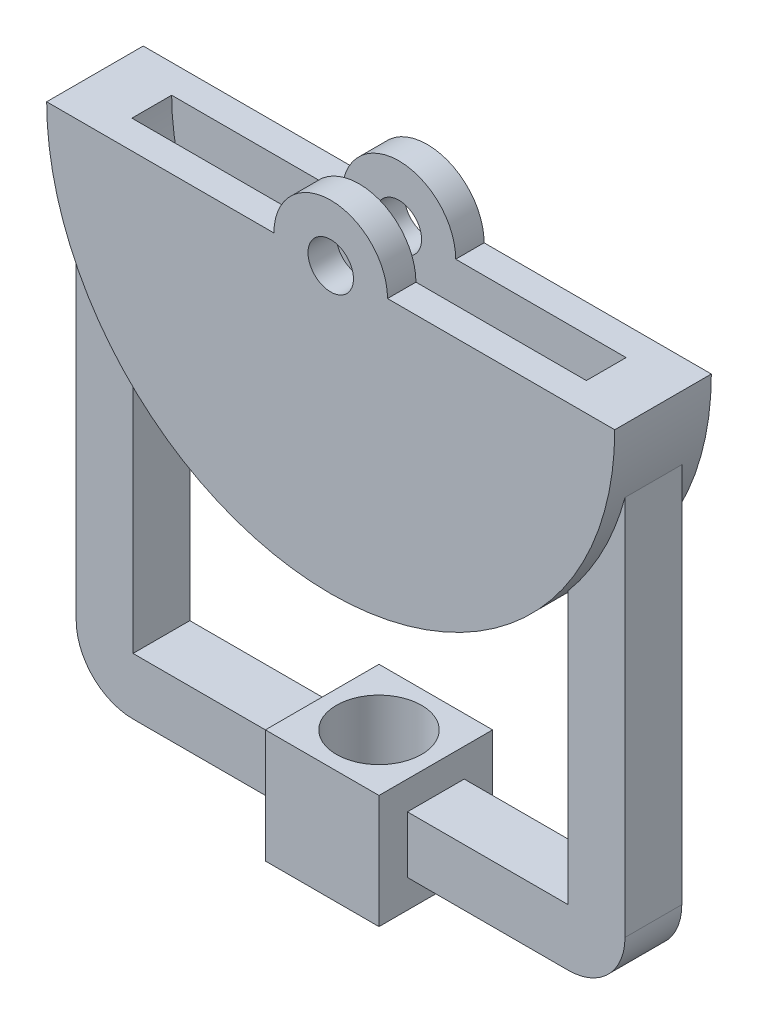
ISO-10303-21;
HEADER;
FILE_DESCRIPTION(('STEP AP214'),'2;1');
FILE_NAME('part.step','',(''),(''),'','','');
FILE_SCHEMA(('AUTOMOTIVE_DESIGN { 1 0 10303 214 1 1 1 1 }'));
ENDSEC;
DATA;
#1=APPLICATION_CONTEXT('core data for automotive mechanical design processes');
#2=APPLICATION_PROTOCOL_DEFINITION('international standard','automotive_design',2000,#1);
#3=PRODUCT_CONTEXT('',#1,'mechanical');
#4=PRODUCT('Part','Part','',(#3));
#5=PRODUCT_RELATED_PRODUCT_CATEGORY('part','',(#4));
#6=PRODUCT_DEFINITION_FORMATION('','',#4);
#7=PRODUCT_DEFINITION_CONTEXT('part definition',#1,'design');
#8=PRODUCT_DEFINITION('design','',#6,#7);
#9=PRODUCT_DEFINITION_SHAPE('','',#8);
#10=(LENGTH_UNIT() NAMED_UNIT(*) SI_UNIT(.MILLI.,.METRE.));
#11=(NAMED_UNIT(*) PLANE_ANGLE_UNIT() SI_UNIT($,.RADIAN.));
#12=(NAMED_UNIT(*) SI_UNIT($,.STERADIAN.) SOLID_ANGLE_UNIT());
#13=UNCERTAINTY_MEASURE_WITH_UNIT(LENGTH_MEASURE(1.E-05),#10,'distance_accuracy_value','');
#14=(GEOMETRIC_REPRESENTATION_CONTEXT(3) GLOBAL_UNCERTAINTY_ASSIGNED_CONTEXT((#13)) GLOBAL_UNIT_ASSIGNED_CONTEXT((#10,
#11,#12)) REPRESENTATION_CONTEXT('',''));
#15=CARTESIAN_POINT('',(0.,0.,0.));
#16=DIRECTION('',(0.,0.,1.));
#17=DIRECTION('',(1.,0.,0.));
#18=AXIS2_PLACEMENT_3D('',#15,#16,#17);
#19=CARTESIAN_POINT('',(0.,0.,3.50000000000001));
#20=DIRECTION('',(0.,0.,1.));
#21=DIRECTION('',(1.,0.,0.));
#22=AXIS2_PLACEMENT_3D('',#19,#20,#21);
#23=PLANE('',#22);
#24=DIRECTION('',(-1.,0.,0.));
#25=VECTOR('',#24,1.);
#26=CARTESIAN_POINT('',(0.,-80.,3.50000000000001));
#27=LINE('',#26,#25);
#28=CARTESIAN_POINT('',(-9.99999999999999,-80.,3.50000000000001));
#29=VERTEX_POINT('',#28);
#30=CARTESIAN_POINT('',(-38.299537742084,-80.,3.50000000000001));
#31=VERTEX_POINT('',#30);
#32=EDGE_CURVE('E257',#29,#31,#27,.T.);
#33=ORIENTED_EDGE('',*,*,#32,.F.);
#34=DIRECTION('',(0.,-1.,0.));
#35=VECTOR('',#34,1.);
#36=CARTESIAN_POINT('',(-9.99999999999999,0.,3.50000000000001));
#37=LINE('',#36,#35);
#38=CARTESIAN_POINT('',(-9.99999999999999,-90.,3.50000000000001));
#39=VERTEX_POINT('',#38);
#40=EDGE_CURVE('E254',#29,#39,#37,.T.);
#41=ORIENTED_EDGE('',*,*,#40,.T.);
#42=DIRECTION('',(-1.,0.,0.));
#43=VECTOR('',#42,1.);
#44=CARTESIAN_POINT('',(0.,-90.,3.50000000000001));
#45=LINE('',#44,#43);
#46=CARTESIAN_POINT('',(-38.299537742084,-90.,3.50000000000001));
#47=VERTEX_POINT('',#46);
#48=EDGE_CURVE('E268',#39,#47,#45,.T.);
#49=ORIENTED_EDGE('',*,*,#48,.T.);
#50=CARTESIAN_POINT('',(-38.299537742084,-80.,3.50000000000001));
#51=DIRECTION('',(0.,0.,1.));
#52=DIRECTION('',(1.,0.,0.));
#53=AXIS2_PLACEMENT_3D('',#50,#51,#52);
#54=CIRCLE('',#53,10.);
#55=CARTESIAN_POINT('',(-48.299537742084,-80.,3.50000000000001));
#56=VERTEX_POINT('',#55);
#57=EDGE_CURVE('E420',#47,#56,#54,.F.);
#58=ORIENTED_EDGE('',*,*,#57,.T.);
#59=DIRECTION('',(0.,1.,0.));
#60=VECTOR('',#59,1.);
#61=CARTESIAN_POINT('',(-48.2995377420841,0.,3.50000000000001));
#62=LINE('',#61,#60);
#63=CARTESIAN_POINT('',(-48.2995377420841,-12.9288303376987,3.50000000000001));
#64=VERTEX_POINT('',#63);
#65=EDGE_CURVE('E266',#56,#64,#62,.T.);
#66=ORIENTED_EDGE('',*,*,#65,.T.);
#67=CARTESIAN_POINT('',(0.,0.,3.50000000000001));
#68=DIRECTION('',(0.,0.,1.));
#69=DIRECTION('',(1.,0.,0.));
#70=AXIS2_PLACEMENT_3D('',#67,#68,#69);
#71=CIRCLE('',#70,50.);
#72=CARTESIAN_POINT('',(-38.299537742084,-32.1425793728923,3.50000000000001));
#73=VERTEX_POINT('',#72);
#74=EDGE_CURVE('E264',#64,#73,#71,.T.);
#75=ORIENTED_EDGE('',*,*,#74,.T.);
#76=DIRECTION('',(0.,1.,0.));
#77=VECTOR('',#76,1.);
#78=CARTESIAN_POINT('',(-38.299537742084,0.,3.50000000000001));
#79=LINE('',#78,#77);
#80=EDGE_CURVE('E260',#31,#73,#79,.T.);
#81=ORIENTED_EDGE('',*,*,#80,.F.);
#82=EDGE_LOOP('',(#33,#41,#49,#58,#66,#75,#81));
#83=FACE_BOUND('',#82,.T.);
#84=ADVANCED_FACE('F35',(#83),#23,.F.);
#85=CARTESIAN_POINT('',(0.,0.,13.5));
#86=DIRECTION('',(0.,0.,1.));
#87=DIRECTION('',(1.,0.,0.));
#88=AXIS2_PLACEMENT_3D('',#85,#86,#87);
#89=PLANE('',#88);
#90=DIRECTION('',(0.,-1.,0.));
#91=VECTOR('',#90,1.);
#92=CARTESIAN_POINT('',(-9.99999999999999,0.,13.5));
#93=LINE('',#92,#91);
#94=CARTESIAN_POINT('',(-9.99999999999999,-80.,13.5));
#95=VERTEX_POINT('',#94);
#96=CARTESIAN_POINT('',(-9.99999999999999,-90.,13.5));
#97=VERTEX_POINT('',#96);
#98=EDGE_CURVE('E11',#95,#97,#93,.T.);
#99=ORIENTED_EDGE('',*,*,#98,.F.);
#100=DIRECTION('',(-1.,0.,0.));
#101=VECTOR('',#100,1.);
#102=CARTESIAN_POINT('',(0.,-80.,13.5));
#103=LINE('',#102,#101);
#104=CARTESIAN_POINT('',(-38.299537742084,-80.,13.5));
#105=VERTEX_POINT('',#104);
#106=EDGE_CURVE('E256',#95,#105,#103,.T.);
#107=ORIENTED_EDGE('',*,*,#106,.T.);
#108=DIRECTION('',(0.,1.,0.));
#109=VECTOR('',#108,1.);
#110=CARTESIAN_POINT('',(-38.299537742084,0.,13.5));
#111=LINE('',#110,#109);
#112=CARTESIAN_POINT('',(-38.299537742084,-32.1425793728923,13.5));
#113=VERTEX_POINT('',#112);
#114=EDGE_CURVE('E285',#105,#113,#111,.T.);
#115=ORIENTED_EDGE('',*,*,#114,.T.);
#116=CARTESIAN_POINT('',(0.,0.,13.5));
#117=DIRECTION('',(0.,0.,1.));
#118=DIRECTION('',(1.,0.,0.));
#119=AXIS2_PLACEMENT_3D('',#116,#117,#118);
#120=CIRCLE('',#119,50.);
#121=CARTESIAN_POINT('',(-48.2995377420841,-12.9288303376987,13.5));
#122=VERTEX_POINT('',#121);
#123=EDGE_CURVE('E287',#122,#113,#120,.T.);
#124=ORIENTED_EDGE('',*,*,#123,.F.);
#125=DIRECTION('',(0.,1.,0.));
#126=VECTOR('',#125,1.);
#127=CARTESIAN_POINT('',(-48.2995377420841,0.,13.5));
#128=LINE('',#127,#126);
#129=CARTESIAN_POINT('',(-48.299537742084,-80.,13.5));
#130=VERTEX_POINT('',#129);
#131=EDGE_CURVE('E290',#130,#122,#128,.T.);
#132=ORIENTED_EDGE('',*,*,#131,.F.);
#133=CARTESIAN_POINT('',(-38.299537742084,-80.,13.5));
#134=DIRECTION('',(0.,0.,1.));
#135=DIRECTION('',(1.,0.,0.));
#136=AXIS2_PLACEMENT_3D('',#133,#134,#135);
#137=CIRCLE('',#136,10.);
#138=CARTESIAN_POINT('',(-38.299537742084,-90.,13.5));
#139=VERTEX_POINT('',#138);
#140=EDGE_CURVE('E415',#130,#139,#137,.T.);
#141=ORIENTED_EDGE('',*,*,#140,.T.);
#142=DIRECTION('',(-1.,0.,0.));
#143=VECTOR('',#142,1.);
#144=CARTESIAN_POINT('',(0.,-90.,13.5));
#145=LINE('',#144,#143);
#146=EDGE_CURVE('E292',#97,#139,#145,.T.);
#147=ORIENTED_EDGE('',*,*,#146,.F.);
#148=EDGE_LOOP('',(#99,#107,#115,#124,#132,#141,#147));
#149=FACE_BOUND('',#148,.T.);
#150=ADVANCED_FACE('F457',(#149),#89,.T.);
#151=CARTESIAN_POINT('',(0.,0.,5.));
#152=DIRECTION('',(0.,0.,-1.));
#153=DIRECTION('',(-1.,0.,0.));
#154=AXIS2_PLACEMENT_3D('',#151,#152,#153);
#155=CYLINDRICAL_SURFACE('',#154,50.);
#156=CARTESIAN_POINT('',(0.,0.,3.50000000000001));
#157=DIRECTION('',(0.,0.,1.));
#158=DIRECTION('',(1.,0.,0.));
#159=AXIS2_PLACEMENT_3D('',#156,#157,#158);
#160=CIRCLE('',#159,50.);
#161=CARTESIAN_POINT('',(38.2995377420841,-32.1425793728923,3.50000000000001));
#162=VERTEX_POINT('',#161);
#163=CARTESIAN_POINT('',(48.2995377420841,-12.9288303376987,3.50000000000001));
#164=VERTEX_POINT('',#163);
#165=EDGE_CURVE('E275',#162,#164,#160,.T.);
#166=ORIENTED_EDGE('',*,*,#165,.F.);
#167=DIRECTION('',(0.,0.,1.));
#168=VECTOR('',#167,1.);
#169=CARTESIAN_POINT('',(38.2995377420841,-32.1425793728923,3.50000000000001));
#170=LINE('',#169,#168);
#171=CARTESIAN_POINT('',(38.2995377420841,-32.1425793728923,13.5));
#172=VERTEX_POINT('',#171);
#173=EDGE_CURVE('E315',#162,#172,#170,.T.);
#174=ORIENTED_EDGE('',*,*,#173,.T.);
#175=CARTESIAN_POINT('',(0.,0.,13.5));
#176=DIRECTION('',(0.,0.,1.));
#177=DIRECTION('',(1.,0.,0.));
#178=AXIS2_PLACEMENT_3D('',#175,#176,#177);
#179=CIRCLE('',#178,50.);
#180=CARTESIAN_POINT('',(48.2995377420841,-12.9288303376987,13.5));
#181=VERTEX_POINT('',#180);
#182=EDGE_CURVE('E300',#172,#181,#179,.T.);
#183=ORIENTED_EDGE('',*,*,#182,.T.);
#184=DIRECTION('',(0.,0.,1.));
#185=VECTOR('',#184,1.);
#186=CARTESIAN_POINT('',(48.2995377420841,-12.9288303376987,3.50000000000001));
#187=LINE('',#186,#185);
#188=EDGE_CURVE('E318',#164,#181,#187,.T.);
#189=ORIENTED_EDGE('',*,*,#188,.F.);
#190=EDGE_LOOP('',(#166,#174,#183,#189));
#191=FACE_BOUND('',#190,.T.);
#192=CARTESIAN_POINT('',(0.,0.,0.));
#193=DIRECTION('',(0.,0.,1.));
#194=DIRECTION('',(1.,0.,0.));
#195=AXIS2_PLACEMENT_3D('',#192,#193,#194);
#196=CIRCLE('',#195,50.);
#197=CARTESIAN_POINT('',(-50.,0.,0.));
#198=VERTEX_POINT('',#197);
#199=CARTESIAN_POINT('',(50.,0.,0.));
#200=VERTEX_POINT('',#199);
#201=EDGE_CURVE('E381',#198,#200,#196,.T.);
#202=ORIENTED_EDGE('',*,*,#201,.T.);
#203=DIRECTION('',(0.,0.,-1.));
#204=VECTOR('',#203,1.);
#205=CARTESIAN_POINT('',(50.,0.,5.));
#206=LINE('',#205,#204);
#207=CARTESIAN_POINT('',(50.,0.,17.));
#208=VERTEX_POINT('',#207);
#209=EDGE_CURVE('E407',#208,#200,#206,.T.);
#210=ORIENTED_EDGE('',*,*,#209,.F.);
#211=CARTESIAN_POINT('',(0.,0.,17.));
#212=DIRECTION('',(0.,0.,1.));
#213=DIRECTION('',(1.,0.,0.));
#214=AXIS2_PLACEMENT_3D('',#211,#212,#213);
#215=CIRCLE('',#214,50.);
#216=CARTESIAN_POINT('',(-50.,0.,17.));
#217=VERTEX_POINT('',#216);
#218=EDGE_CURVE('E343',#217,#208,#215,.T.);
#219=ORIENTED_EDGE('',*,*,#218,.F.);
#220=DIRECTION('',(0.,0.,-1.));
#221=VECTOR('',#220,1.);
#222=CARTESIAN_POINT('',(-50.,0.,5.));
#223=LINE('',#222,#221);
#224=EDGE_CURVE('E391',#217,#198,#223,.T.);
#225=ORIENTED_EDGE('',*,*,#224,.T.);
#226=EDGE_LOOP('',(#202,#210,#219,#225));
#227=FACE_BOUND('',#226,.T.);
#228=ORIENTED_EDGE('',*,*,#74,.F.);
#229=DIRECTION('',(0.,0.,1.));
#230=VECTOR('',#229,1.);
#231=CARTESIAN_POINT('',(-48.2995377420841,-12.9288303376987,3.50000000000001));
#232=LINE('',#231,#230);
#233=EDGE_CURVE('E330',#64,#122,#232,.T.);
#234=ORIENTED_EDGE('',*,*,#233,.T.);
#235=ORIENTED_EDGE('',*,*,#123,.T.);
#236=DIRECTION('',(0.,0.,1.));
#237=VECTOR('',#236,1.);
#238=CARTESIAN_POINT('',(-38.299537742084,-32.1425793728923,3.50000000000001));
#239=LINE('',#238,#237);
#240=EDGE_CURVE('E333',#73,#113,#239,.T.);
#241=ORIENTED_EDGE('',*,*,#240,.F.);
#242=EDGE_LOOP('',(#228,#234,#235,#241));
#243=FACE_BOUND('',#242,.T.);
#244=ADVANCED_FACE('F453',(#191,#227,#243),#155,.T.);
#245=CARTESIAN_POINT('',(0.,0.,5.));
#246=DIRECTION('',(0.,0.,1.));
#247=DIRECTION('',(1.,0.,0.));
#248=AXIS2_PLACEMENT_3D('',#245,#246,#247);
#249=PLANE('',#248);
#250=CARTESIAN_POINT('',(0.,0.,5.));
#251=DIRECTION('',(0.,0.,1.));
#252=DIRECTION('',(1.,0.,0.));
#253=AXIS2_PLACEMENT_3D('',#250,#251,#252);
#254=CIRCLE('',#253,4.);
#255=CARTESIAN_POINT('',(4.,0.,5.));
#256=VERTEX_POINT('',#255);
#257=EDGE_CURVE('E378',#256,#256,#254,.T.);
#258=ORIENTED_EDGE('',*,*,#257,.F.);
#259=EDGE_LOOP('',(#258));
#260=FACE_BOUND('',#259,.T.);
#261=CARTESIAN_POINT('',(0.,0.,5.));
#262=DIRECTION('',(0.,0.,-1.));
#263=DIRECTION('',(1.,0.,0.));
#264=AXIS2_PLACEMENT_3D('',#261,#262,#263);
#265=CIRCLE('',#264,40.);
#266=CARTESIAN_POINT('',(40.,0.,5.));
#267=VERTEX_POINT('',#266);
#268=CARTESIAN_POINT('',(-40.,0.,5.));
#269=VERTEX_POINT('',#268);
#270=EDGE_CURVE('E365',#267,#269,#265,.T.);
#271=ORIENTED_EDGE('',*,*,#270,.F.);
#272=DIRECTION('',(-1.,0.,0.));
#273=VECTOR('',#272,1.);
#274=CARTESIAN_POINT('',(10.,0.,5.));
#275=LINE('',#274,#273);
#276=CARTESIAN_POINT('',(10.,0.,5.));
#277=VERTEX_POINT('',#276);
#278=EDGE_CURVE('E384',#267,#277,#275,.T.);
#279=ORIENTED_EDGE('',*,*,#278,.T.);
#280=CARTESIAN_POINT('',(0.,0.,5.));
#281=DIRECTION('',(0.,0.,1.));
#282=DIRECTION('',(1.,0.,0.));
#283=AXIS2_PLACEMENT_3D('',#280,#281,#282);
#284=CIRCLE('',#283,10.);
#285=CARTESIAN_POINT('',(-10.,0.,5.));
#286=VERTEX_POINT('',#285);
#287=EDGE_CURVE('E386',#277,#286,#284,.T.);
#288=ORIENTED_EDGE('',*,*,#287,.T.);
#289=DIRECTION('',(-1.,0.,0.));
#290=VECTOR('',#289,1.);
#291=CARTESIAN_POINT('',(-50.,0.,5.));
#292=LINE('',#291,#290);
#293=EDGE_CURVE('E389',#286,#269,#292,.T.);
#294=ORIENTED_EDGE('',*,*,#293,.T.);
#295=EDGE_LOOP('',(#271,#279,#288,#294));
#296=FACE_BOUND('',#295,.T.);
#297=ADVANCED_FACE('F456',(#260,#296),#249,.T.);
#298=CARTESIAN_POINT('',(0.,0.,0.));
#299=DIRECTION('',(0.,0.,1.));
#300=DIRECTION('',(1.,0.,0.));
#301=AXIS2_PLACEMENT_3D('',#298,#299,#300);
#302=PLANE('',#301);
#303=ORIENTED_EDGE('',*,*,#201,.F.);
#304=DIRECTION('',(-1.,0.,0.));
#305=VECTOR('',#304,1.);
#306=CARTESIAN_POINT('',(-50.,0.,0.));
#307=LINE('',#306,#305);
#308=CARTESIAN_POINT('',(-10.,0.,0.));
#309=VERTEX_POINT('',#308);
#310=EDGE_CURVE('E387',#309,#198,#307,.T.);
#311=ORIENTED_EDGE('',*,*,#310,.F.);
#312=CARTESIAN_POINT('',(0.,0.,0.));
#313=DIRECTION('',(0.,0.,1.));
#314=DIRECTION('',(1.,0.,0.));
#315=AXIS2_PLACEMENT_3D('',#312,#313,#314);
#316=CIRCLE('',#315,10.);
#317=CARTESIAN_POINT('',(10.,0.,0.));
#318=VERTEX_POINT('',#317);
#319=EDGE_CURVE('E396',#318,#309,#316,.T.);
#320=ORIENTED_EDGE('',*,*,#319,.F.);
#321=DIRECTION('',(-1.,0.,0.));
#322=VECTOR('',#321,1.);
#323=CARTESIAN_POINT('',(10.,0.,0.));
#324=LINE('',#323,#322);
#325=EDGE_CURVE('E394',#200,#318,#324,.T.);
#326=ORIENTED_EDGE('',*,*,#325,.F.);
#327=EDGE_LOOP('',(#303,#311,#320,#326));
#328=FACE_BOUND('',#327,.T.);
#329=CARTESIAN_POINT('',(0.,0.,0.));
#330=DIRECTION('',(0.,0.,1.));
#331=DIRECTION('',(1.,0.,0.));
#332=AXIS2_PLACEMENT_3D('',#329,#330,#331);
#333=CIRCLE('',#332,4.);
#334=CARTESIAN_POINT('',(4.,0.,0.));
#335=VERTEX_POINT('',#334);
#336=EDGE_CURVE('E377',#335,#335,#333,.T.);
#337=ORIENTED_EDGE('',*,*,#336,.T.);
#338=EDGE_LOOP('',(#337));
#339=FACE_BOUND('',#338,.T.);
#340=ADVANCED_FACE('F579',(#328,#339),#302,.F.);
#341=CARTESIAN_POINT('',(10.,0.,5.));
#342=DIRECTION('',(0.,-1.,0.));
#343=DIRECTION('',(0.,0.,-1.));
#344=AXIS2_PLACEMENT_3D('',#341,#342,#343);
#345=PLANE('',#344);
#346=ORIENTED_EDGE('',*,*,#325,.T.);
#347=DIRECTION('',(0.,0.,-1.));
#348=VECTOR('',#347,1.);
#349=CARTESIAN_POINT('',(10.,0.,5.));
#350=LINE('',#349,#348);
#351=EDGE_CURVE('E404',#277,#318,#350,.T.);
#352=ORIENTED_EDGE('',*,*,#351,.F.);
#353=ORIENTED_EDGE('',*,*,#278,.F.);
#354=DIRECTION('',(0.,0.,-1.));
#355=VECTOR('',#354,1.);
#356=CARTESIAN_POINT('',(40.,0.,12.));
#357=LINE('',#356,#355);
#358=CARTESIAN_POINT('',(40.,0.,12.));
#359=VERTEX_POINT('',#358);
#360=EDGE_CURVE('E374',#359,#267,#357,.T.);
#361=ORIENTED_EDGE('',*,*,#360,.F.);
#362=DIRECTION('',(-1.,0.,0.));
#363=VECTOR('',#362,1.);
#364=CARTESIAN_POINT('',(10.,0.,12.));
#365=LINE('',#364,#363);
#366=CARTESIAN_POINT('',(10.,0.,12.));
#367=VERTEX_POINT('',#366);
#368=EDGE_CURVE('E340',#359,#367,#365,.T.);
#369=ORIENTED_EDGE('',*,*,#368,.T.);
#370=DIRECTION('',(0.,0.,-1.));
#371=VECTOR('',#370,1.);
#372=CARTESIAN_POINT('',(10.,0.,17.));
#373=LINE('',#372,#371);
#374=CARTESIAN_POINT('',(10.,0.,17.));
#375=VERTEX_POINT('',#374);
#376=EDGE_CURVE('E362',#375,#367,#373,.T.);
#377=ORIENTED_EDGE('',*,*,#376,.F.);
#378=DIRECTION('',(-1.,0.,0.));
#379=VECTOR('',#378,1.);
#380=CARTESIAN_POINT('',(10.,0.,17.));
#381=LINE('',#380,#379);
#382=EDGE_CURVE('E346',#208,#375,#381,.T.);
#383=ORIENTED_EDGE('',*,*,#382,.F.);
#384=ORIENTED_EDGE('',*,*,#209,.T.);
#385=EDGE_LOOP('',(#346,#352,#353,#361,#369,#377,#383,#384));
#386=FACE_BOUND('',#385,.T.);
#387=ADVANCED_FACE('F583',(#386),#345,.F.);
#388=CARTESIAN_POINT('',(0.,0.,5.));
#389=DIRECTION('',(0.,0.,-1.));
#390=DIRECTION('',(-1.,0.,0.));
#391=AXIS2_PLACEMENT_3D('',#388,#389,#390);
#392=CYLINDRICAL_SURFACE('',#391,10.);
#393=ORIENTED_EDGE('',*,*,#319,.T.);
#394=DIRECTION('',(0.,0.,-1.));
#395=VECTOR('',#394,1.);
#396=CARTESIAN_POINT('',(-10.,0.,5.));
#397=LINE('',#396,#395);
#398=EDGE_CURVE('E401',#286,#309,#397,.T.);
#399=ORIENTED_EDGE('',*,*,#398,.F.);
#400=ORIENTED_EDGE('',*,*,#287,.F.);
#401=ORIENTED_EDGE('',*,*,#351,.T.);
#402=EDGE_LOOP('',(#393,#399,#400,#401));
#403=FACE_BOUND('',#402,.T.);
#404=ADVANCED_FACE('F587',(#403),#392,.T.);
#405=CARTESIAN_POINT('',(-50.,0.,5.));
#406=DIRECTION('',(0.,-1.,0.));
#407=DIRECTION('',(0.,0.,-1.));
#408=AXIS2_PLACEMENT_3D('',#405,#406,#407);
#409=PLANE('',#408);
#410=ORIENTED_EDGE('',*,*,#310,.T.);
#411=ORIENTED_EDGE('',*,*,#224,.F.);
#412=DIRECTION('',(-1.,0.,0.));
#413=VECTOR('',#412,1.);
#414=CARTESIAN_POINT('',(-50.,0.,17.));
#415=LINE('',#414,#413);
#416=CARTESIAN_POINT('',(-10.,0.,17.));
#417=VERTEX_POINT('',#416);
#418=EDGE_CURVE('E351',#417,#217,#415,.T.);
#419=ORIENTED_EDGE('',*,*,#418,.F.);
#420=DIRECTION('',(0.,0.,-1.));
#421=VECTOR('',#420,1.);
#422=CARTESIAN_POINT('',(-10.,0.,17.));
#423=LINE('',#422,#421);
#424=CARTESIAN_POINT('',(-10.,0.,12.));
#425=VERTEX_POINT('',#424);
#426=EDGE_CURVE('E354',#417,#425,#423,.T.);
#427=ORIENTED_EDGE('',*,*,#426,.T.);
#428=DIRECTION('',(-1.,0.,0.));
#429=VECTOR('',#428,1.);
#430=CARTESIAN_POINT('',(-50.,0.,12.));
#431=LINE('',#430,#429);
#432=CARTESIAN_POINT('',(-40.,0.,12.));
#433=VERTEX_POINT('',#432);
#434=EDGE_CURVE('E347',#425,#433,#431,.T.);
#435=ORIENTED_EDGE('',*,*,#434,.T.);
#436=DIRECTION('',(0.,0.,-1.));
#437=VECTOR('',#436,1.);
#438=CARTESIAN_POINT('',(-40.,0.,12.));
#439=LINE('',#438,#437);
#440=EDGE_CURVE('E369',#433,#269,#439,.T.);
#441=ORIENTED_EDGE('',*,*,#440,.T.);
#442=ORIENTED_EDGE('',*,*,#293,.F.);
#443=ORIENTED_EDGE('',*,*,#398,.T.);
#444=EDGE_LOOP('',(#410,#411,#419,#427,#435,#441,#442,#443));
#445=FACE_BOUND('',#444,.T.);
#446=ADVANCED_FACE('F575',(#445),#409,.F.);
#447=CARTESIAN_POINT('',(0.,0.,5.));
#448=DIRECTION('',(0.,0.,-1.));
#449=DIRECTION('',(-1.,0.,0.));
#450=AXIS2_PLACEMENT_3D('',#447,#448,#449);
#451=CYLINDRICAL_SURFACE('',#450,4.);
#452=ORIENTED_EDGE('',*,*,#257,.T.);
#453=EDGE_LOOP('',(#452));
#454=FACE_BOUND('',#453,.T.);
#455=ORIENTED_EDGE('',*,*,#336,.F.);
#456=EDGE_LOOP('',(#455));
#457=FACE_BOUND('',#456,.T.);
#458=ADVANCED_FACE('F571',(#454,#457),#451,.F.);
#459=CARTESIAN_POINT('',(0.,0.,12.));
#460=DIRECTION('',(0.,0.,-1.));
#461=DIRECTION('',(-1.,0.,0.));
#462=AXIS2_PLACEMENT_3D('',#459,#460,#461);
#463=CYLINDRICAL_SURFACE('',#462,40.);
#464=ORIENTED_EDGE('',*,*,#270,.T.);
#465=ORIENTED_EDGE('',*,*,#440,.F.);
#466=CARTESIAN_POINT('',(0.,0.,12.));
#467=DIRECTION('',(0.,0.,-1.));
#468=DIRECTION('',(1.,0.,0.));
#469=AXIS2_PLACEMENT_3D('',#466,#467,#468);
#470=CIRCLE('',#469,40.);
#471=EDGE_CURVE('E366',#359,#433,#470,.T.);
#472=ORIENTED_EDGE('',*,*,#471,.F.);
#473=ORIENTED_EDGE('',*,*,#360,.T.);
#474=EDGE_LOOP('',(#464,#465,#472,#473));
#475=FACE_BOUND('',#474,.T.);
#476=ADVANCED_FACE('F564',(#475),#463,.F.);
#477=CARTESIAN_POINT('',(0.,0.,12.));
#478=DIRECTION('',(0.,0.,1.));
#479=DIRECTION('',(1.,0.,0.));
#480=AXIS2_PLACEMENT_3D('',#477,#478,#479);
#481=PLANE('',#480);
#482=CARTESIAN_POINT('',(0.,0.,12.));
#483=DIRECTION('',(0.,0.,1.));
#484=DIRECTION('',(1.,0.,0.));
#485=AXIS2_PLACEMENT_3D('',#482,#483,#484);
#486=CIRCLE('',#485,4.);
#487=CARTESIAN_POINT('',(4.,0.,12.));
#488=VERTEX_POINT('',#487);
#489=EDGE_CURVE('E307',#488,#488,#486,.T.);
#490=ORIENTED_EDGE('',*,*,#489,.T.);
#491=EDGE_LOOP('',(#490));
#492=FACE_BOUND('',#491,.T.);
#493=ORIENTED_EDGE('',*,*,#368,.F.);
#494=ORIENTED_EDGE('',*,*,#471,.T.);
#495=ORIENTED_EDGE('',*,*,#434,.F.);
#496=CARTESIAN_POINT('',(0.,0.,12.));
#497=DIRECTION('',(0.,0.,1.));
#498=DIRECTION('',(1.,0.,0.));
#499=AXIS2_PLACEMENT_3D('',#496,#497,#498);
#500=CIRCLE('',#499,10.);
#501=EDGE_CURVE('E356',#367,#425,#500,.T.);
#502=ORIENTED_EDGE('',*,*,#501,.F.);
#503=EDGE_LOOP('',(#493,#494,#495,#502));
#504=FACE_BOUND('',#503,.T.);
#505=ADVANCED_FACE('F560',(#492,#504),#481,.F.);
#506=CARTESIAN_POINT('',(0.,0.,17.));
#507=DIRECTION('',(0.,0.,1.));
#508=DIRECTION('',(1.,0.,0.));
#509=AXIS2_PLACEMENT_3D('',#506,#507,#508);
#510=PLANE('',#509);
#511=ORIENTED_EDGE('',*,*,#218,.T.);
#512=ORIENTED_EDGE('',*,*,#382,.T.);
#513=CARTESIAN_POINT('',(0.,0.,17.));
#514=DIRECTION('',(0.,0.,1.));
#515=DIRECTION('',(1.,0.,0.));
#516=AXIS2_PLACEMENT_3D('',#513,#514,#515);
#517=CIRCLE('',#516,10.);
#518=EDGE_CURVE('E349',#375,#417,#517,.T.);
#519=ORIENTED_EDGE('',*,*,#518,.T.);
#520=ORIENTED_EDGE('',*,*,#418,.T.);
#521=EDGE_LOOP('',(#511,#512,#519,#520));
#522=FACE_BOUND('',#521,.T.);
#523=CARTESIAN_POINT('',(0.,0.,17.));
#524=DIRECTION('',(0.,0.,1.));
#525=DIRECTION('',(1.,0.,0.));
#526=AXIS2_PLACEMENT_3D('',#523,#524,#525);
#527=CIRCLE('',#526,4.);
#528=CARTESIAN_POINT('',(4.,0.,17.));
#529=VERTEX_POINT('',#528);
#530=EDGE_CURVE('E337',#529,#529,#527,.T.);
#531=ORIENTED_EDGE('',*,*,#530,.F.);
#532=EDGE_LOOP('',(#531));
#533=FACE_BOUND('',#532,.T.);
#534=ADVANCED_FACE('F557',(#522,#533),#510,.T.);
#535=CARTESIAN_POINT('',(0.,0.,17.));
#536=DIRECTION('',(0.,0.,-1.));
#537=DIRECTION('',(-1.,0.,0.));
#538=AXIS2_PLACEMENT_3D('',#535,#536,#537);
#539=CYLINDRICAL_SURFACE('',#538,10.);
#540=ORIENTED_EDGE('',*,*,#501,.T.);
#541=ORIENTED_EDGE('',*,*,#426,.F.);
#542=ORIENTED_EDGE('',*,*,#518,.F.);
#543=ORIENTED_EDGE('',*,*,#376,.T.);
#544=EDGE_LOOP('',(#540,#541,#542,#543));
#545=FACE_BOUND('',#544,.T.);
#546=ADVANCED_FACE('F555',(#545),#539,.T.);
#547=CARTESIAN_POINT('',(0.,0.,17.));
#548=DIRECTION('',(0.,0.,-1.));
#549=DIRECTION('',(-1.,0.,0.));
#550=AXIS2_PLACEMENT_3D('',#547,#548,#549);
#551=CYLINDRICAL_SURFACE('',#550,4.);
#552=ORIENTED_EDGE('',*,*,#530,.T.);
#553=EDGE_LOOP('',(#552));
#554=FACE_BOUND('',#553,.T.);
#555=ORIENTED_EDGE('',*,*,#489,.F.);
#556=EDGE_LOOP('',(#555));
#557=FACE_BOUND('',#556,.T.);
#558=ADVANCED_FACE('F552',(#554,#557),#551,.F.);
#559=CARTESIAN_POINT('',(0.,-80.,3.50000000000001));
#560=DIRECTION('',(0.,1.,0.));
#561=DIRECTION('',(-1.,0.,0.));
#562=AXIS2_PLACEMENT_3D('',#559,#560,#561);
#563=PLANE('',#562);
#564=ORIENTED_EDGE('',*,*,#106,.F.);
#565=DIRECTION('',(0.,0.,1.));
#566=VECTOR('',#565,1.);
#567=CARTESIAN_POINT('',(-9.99999999999999,-80.,3.50000000000001));
#568=LINE('',#567,#566);
#569=EDGE_CURVE('E221',#29,#95,#568,.T.);
#570=ORIENTED_EDGE('',*,*,#569,.F.);
#571=ORIENTED_EDGE('',*,*,#32,.T.);
#572=DIRECTION('',(0.,0.,1.));
#573=VECTOR('',#572,1.);
#574=CARTESIAN_POINT('',(-38.299537742084,-80.,3.50000000000001));
#575=LINE('',#574,#573);
#576=EDGE_CURVE('E282',#31,#105,#575,.T.);
#577=ORIENTED_EDGE('',*,*,#576,.T.);
#578=EDGE_LOOP('',(#564,#570,#571,#577));
#579=FACE_BOUND('',#578,.T.);
#580=ADVANCED_FACE('F473',(#579),#563,.T.);
#581=CARTESIAN_POINT('',(-10.,0.,3.50000000000001));
#582=DIRECTION('',(-1.,0.,0.));
#583=DIRECTION('',(0.,-1.,0.));
#584=AXIS2_PLACEMENT_3D('',#581,#582,#583);
#585=PLANE('',#584);
#586=ORIENTED_EDGE('',*,*,#40,.F.);
#587=ORIENTED_EDGE('',*,*,#569,.T.);
#588=ORIENTED_EDGE('',*,*,#98,.T.);
#589=DIRECTION('',(0.,0.,1.));
#590=VECTOR('',#589,1.);
#591=CARTESIAN_POINT('',(-9.99999999999999,-90.,3.50000000000001));
#592=LINE('',#591,#590);
#593=EDGE_CURVE('E328',#39,#97,#592,.T.);
#594=ORIENTED_EDGE('',*,*,#593,.F.);
#595=EDGE_LOOP('',(#586,#587,#588,#594));
#596=FACE_BOUND('',#595,.T.);
#597=DIRECTION('',(0.,0.,1.));
#598=VECTOR('',#597,1.);
#599=CARTESIAN_POINT('',(-9.99999999999999,-75.,3.50000000000001));
#600=LINE('',#599,#598);
#601=CARTESIAN_POINT('',(-9.99999999999999,-75.,-1.5));
#602=VERTEX_POINT('',#601);
#603=CARTESIAN_POINT('',(-9.99999999999999,-75.,18.5));
#604=VERTEX_POINT('',#603);
#605=EDGE_CURVE('E210',#602,#604,#600,.T.);
#606=ORIENTED_EDGE('',*,*,#605,.F.);
#607=DIRECTION('',(0.,-1.,0.));
#608=VECTOR('',#607,1.);
#609=CARTESIAN_POINT('',(-9.99999999999999,-75.,-1.5));
#610=LINE('',#609,#608);
#611=CARTESIAN_POINT('',(-9.99999999999999,-95.,-1.5));
#612=VERTEX_POINT('',#611);
#613=EDGE_CURVE('E213',#602,#612,#610,.T.);
#614=ORIENTED_EDGE('',*,*,#613,.T.);
#615=DIRECTION('',(0.,0.,1.));
#616=VECTOR('',#615,1.);
#617=CARTESIAN_POINT('',(-9.99999999999999,-95.,3.50000000000001));
#618=LINE('',#617,#616);
#619=CARTESIAN_POINT('',(-9.99999999999999,-95.,18.5));
#620=VERTEX_POINT('',#619);
#621=EDGE_CURVE('E326',#612,#620,#618,.T.);
#622=ORIENTED_EDGE('',*,*,#621,.T.);
#623=DIRECTION('',(0.,-1.,0.));
#624=VECTOR('',#623,1.);
#625=CARTESIAN_POINT('',(-9.99999999999999,-75.,18.5));
#626=LINE('',#625,#624);
#627=EDGE_CURVE('E216',#604,#620,#626,.T.);
#628=ORIENTED_EDGE('',*,*,#627,.F.);
#629=EDGE_LOOP('',(#606,#614,#622,#628));
#630=FACE_BOUND('',#629,.T.);
#631=ADVANCED_FACE('F212',(#596,#630),#585,.T.);
#632=CARTESIAN_POINT('',(0.,-75.,3.50000000000001));
#633=DIRECTION('',(0.,-1.,0.));
#634=DIRECTION('',(0.,0.,-1.));
#635=AXIS2_PLACEMENT_3D('',#632,#633,#634);
#636=PLANE('',#635);
#637=CARTESIAN_POINT('',(0.,-75.,8.5));
#638=DIRECTION('',(0.,-1.,0.));
#639=DIRECTION('',(0.,0.,-1.));
#640=AXIS2_PLACEMENT_3D('',#637,#638,#639);
#641=CIRCLE('',#640,7.5);
#642=CARTESIAN_POINT('',(0.,-75.,1.));
#643=VERTEX_POINT('',#642);
#644=EDGE_CURVE('E245',#643,#643,#641,.T.);
#645=ORIENTED_EDGE('',*,*,#644,.T.);
#646=EDGE_LOOP('',(#645));
#647=FACE_BOUND('',#646,.T.);
#648=ORIENTED_EDGE('',*,*,#605,.T.);
#649=DIRECTION('',(-1.,0.,0.));
#650=VECTOR('',#649,1.);
#651=CARTESIAN_POINT('',(-9.99999999999999,-75.,18.5));
#652=LINE('',#651,#650);
#653=CARTESIAN_POINT('',(10.,-75.,18.5));
#654=VERTEX_POINT('',#653);
#655=EDGE_CURVE('E232',#654,#604,#652,.T.);
#656=ORIENTED_EDGE('',*,*,#655,.F.);
#657=DIRECTION('',(0.,0.,1.));
#658=VECTOR('',#657,1.);
#659=CARTESIAN_POINT('',(9.99999999999999,-75.,3.50000000000001));
#660=LINE('',#659,#658);
#661=CARTESIAN_POINT('',(10.,-75.,-1.5));
#662=VERTEX_POINT('',#661);
#663=EDGE_CURVE('E222',#662,#654,#660,.T.);
#664=ORIENTED_EDGE('',*,*,#663,.F.);
#665=DIRECTION('',(1.,0.,0.));
#666=VECTOR('',#665,1.);
#667=CARTESIAN_POINT('',(-9.99999999999999,-75.,-1.5));
#668=LINE('',#667,#666);
#669=EDGE_CURVE('E228',#602,#662,#668,.T.);
#670=ORIENTED_EDGE('',*,*,#669,.F.);
#671=EDGE_LOOP('',(#648,#656,#664,#670));
#672=FACE_BOUND('',#671,.T.);
#673=ADVANCED_FACE('F234',(#647,#672),#636,.F.);
#674=CARTESIAN_POINT('',(9.99999999999998,0.,3.50000000000001));
#675=DIRECTION('',(-1.,0.,0.));
#676=DIRECTION('',(0.,-1.,0.));
#677=AXIS2_PLACEMENT_3D('',#674,#675,#676);
#678=PLANE('',#677);
#679=DIRECTION('',(0.,0.,1.));
#680=VECTOR('',#679,1.);
#681=CARTESIAN_POINT('',(9.99999999999999,-95.,3.50000000000001));
#682=LINE('',#681,#680);
#683=CARTESIAN_POINT('',(10.,-95.,-1.5));
#684=VERTEX_POINT('',#683);
#685=CARTESIAN_POINT('',(10.,-95.,18.5));
#686=VERTEX_POINT('',#685);
#687=EDGE_CURVE('E324',#684,#686,#682,.T.);
#688=ORIENTED_EDGE('',*,*,#687,.F.);
#689=DIRECTION('',(0.,-1.,0.));
#690=VECTOR('',#689,1.);
#691=CARTESIAN_POINT('',(10.,-75.,-1.5));
#692=LINE('',#691,#690);
#693=EDGE_CURVE('E231',#662,#684,#692,.T.);
#694=ORIENTED_EDGE('',*,*,#693,.F.);
#695=ORIENTED_EDGE('',*,*,#663,.T.);
#696=DIRECTION('',(0.,-1.,0.));
#697=VECTOR('',#696,1.);
#698=CARTESIAN_POINT('',(10.,-75.,18.5));
#699=LINE('',#698,#697);
#700=EDGE_CURVE('E249',#654,#686,#699,.T.);
#701=ORIENTED_EDGE('',*,*,#700,.T.);
#702=EDGE_LOOP('',(#688,#694,#695,#701));
#703=FACE_BOUND('',#702,.T.);
#704=DIRECTION('',(0.,1.,0.));
#705=VECTOR('',#704,1.);
#706=CARTESIAN_POINT('',(10.,0.,3.50000000000001));
#707=LINE('',#706,#705);
#708=CARTESIAN_POINT('',(10.,-90.,3.50000000000001));
#709=VERTEX_POINT('',#708);
#710=CARTESIAN_POINT('',(10.,-80.,3.50000000000001));
#711=VERTEX_POINT('',#710);
#712=EDGE_CURVE('E248',#709,#711,#707,.T.);
#713=ORIENTED_EDGE('',*,*,#712,.F.);
#714=DIRECTION('',(0.,0.,1.));
#715=VECTOR('',#714,1.);
#716=CARTESIAN_POINT('',(9.99999999999999,-90.,3.50000000000001));
#717=LINE('',#716,#715);
#718=CARTESIAN_POINT('',(9.99999999999999,-90.,13.5));
#719=VERTEX_POINT('',#718);
#720=EDGE_CURVE('E321',#709,#719,#717,.T.);
#721=ORIENTED_EDGE('',*,*,#720,.T.);
#722=DIRECTION('',(0.,1.,0.));
#723=VECTOR('',#722,1.);
#724=CARTESIAN_POINT('',(10.,0.,13.5));
#725=LINE('',#724,#723);
#726=CARTESIAN_POINT('',(9.99999999999999,-80.,13.5));
#727=VERTEX_POINT('',#726);
#728=EDGE_CURVE('E43',#719,#727,#725,.T.);
#729=ORIENTED_EDGE('',*,*,#728,.T.);
#730=DIRECTION('',(0.,0.,1.));
#731=VECTOR('',#730,1.);
#732=CARTESIAN_POINT('',(9.99999999999999,-80.,3.50000000000001));
#733=LINE('',#732,#731);
#734=EDGE_CURVE('E310',#711,#727,#733,.T.);
#735=ORIENTED_EDGE('',*,*,#734,.F.);
#736=EDGE_LOOP('',(#713,#721,#729,#735));
#737=FACE_BOUND('',#736,.T.);
#738=ADVANCED_FACE('F428',(#703,#737),#678,.F.);
#739=CARTESIAN_POINT('',(0.,-80.,3.50000000000001));
#740=DIRECTION('',(0.,-1.,0.));
#741=DIRECTION('',(0.,0.,-1.));
#742=AXIS2_PLACEMENT_3D('',#739,#740,#741);
#743=PLANE('',#742);
#744=DIRECTION('',(1.,0.,0.));
#745=VECTOR('',#744,1.);
#746=CARTESIAN_POINT('',(0.,-80.,13.5));
#747=LINE('',#746,#745);
#748=CARTESIAN_POINT('',(38.299537742084,-80.,13.5));
#749=VERTEX_POINT('',#748);
#750=EDGE_CURVE('E261',#727,#749,#747,.T.);
#751=ORIENTED_EDGE('',*,*,#750,.T.);
#752=DIRECTION('',(0.,0.,1.));
#753=VECTOR('',#752,1.);
#754=CARTESIAN_POINT('',(38.299537742084,-80.,3.50000000000001));
#755=LINE('',#754,#753);
#756=CARTESIAN_POINT('',(38.299537742084,-80.,3.50000000000001));
#757=VERTEX_POINT('',#756);
#758=EDGE_CURVE('E312',#757,#749,#755,.T.);
#759=ORIENTED_EDGE('',*,*,#758,.F.);
#760=DIRECTION('',(1.,0.,0.));
#761=VECTOR('',#760,1.);
#762=CARTESIAN_POINT('',(0.,-80.,3.50000000000001));
#763=LINE('',#762,#761);
#764=EDGE_CURVE('E280',#711,#757,#763,.T.);
#765=ORIENTED_EDGE('',*,*,#764,.F.);
#766=ORIENTED_EDGE('',*,*,#734,.T.);
#767=EDGE_LOOP('',(#751,#759,#765,#766));
#768=FACE_BOUND('',#767,.T.);
#769=ADVANCED_FACE('F439',(#768),#743,.F.);
#770=CARTESIAN_POINT('',(38.2995377420841,0.,3.50000000000001));
#771=DIRECTION('',(1.,0.,0.));
#772=DIRECTION('',(0.,1.,0.));
#773=AXIS2_PLACEMENT_3D('',#770,#771,#772);
#774=PLANE('',#773);
#775=DIRECTION('',(0.,1.,0.));
#776=VECTOR('',#775,1.);
#777=CARTESIAN_POINT('',(38.2995377420841,0.,13.5));
#778=LINE('',#777,#776);
#779=EDGE_CURVE('E303',#749,#172,#778,.T.);
#780=ORIENTED_EDGE('',*,*,#779,.T.);
#781=ORIENTED_EDGE('',*,*,#173,.F.);
#782=DIRECTION('',(0.,1.,0.));
#783=VECTOR('',#782,1.);
#784=CARTESIAN_POINT('',(38.2995377420841,0.,3.50000000000001));
#785=LINE('',#784,#783);
#786=EDGE_CURVE('E278',#757,#162,#785,.T.);
#787=ORIENTED_EDGE('',*,*,#786,.F.);
#788=ORIENTED_EDGE('',*,*,#758,.T.);
#789=EDGE_LOOP('',(#780,#781,#787,#788));
#790=FACE_BOUND('',#789,.T.);
#791=ADVANCED_FACE('F442',(#790),#774,.F.);
#792=CARTESIAN_POINT('',(48.2995377420841,0.,3.50000000000001));
#793=DIRECTION('',(1.,0.,0.));
#794=DIRECTION('',(0.,1.,0.));
#795=AXIS2_PLACEMENT_3D('',#792,#793,#794);
#796=PLANE('',#795);
#797=DIRECTION('',(0.,1.,0.));
#798=VECTOR('',#797,1.);
#799=CARTESIAN_POINT('',(48.2995377420841,0.,13.5));
#800=LINE('',#799,#798);
#801=CARTESIAN_POINT('',(48.299537742084,-80.,13.5));
#802=VERTEX_POINT('',#801);
#803=EDGE_CURVE('E298',#802,#181,#800,.T.);
#804=ORIENTED_EDGE('',*,*,#803,.F.);
#805=DIRECTION('',(0.,0.,1.));
#806=VECTOR('',#805,1.);
#807=CARTESIAN_POINT('',(48.299537742084,-80.,3.50000000000001));
#808=LINE('',#807,#806);
#809=CARTESIAN_POINT('',(48.299537742084,-80.,3.50000000000001));
#810=VERTEX_POINT('',#809);
#811=EDGE_CURVE('E58',#802,#810,#808,.F.);
#812=ORIENTED_EDGE('',*,*,#811,.T.);
#813=DIRECTION('',(0.,1.,0.));
#814=VECTOR('',#813,1.);
#815=CARTESIAN_POINT('',(48.2995377420841,0.,3.50000000000001));
#816=LINE('',#815,#814);
#817=EDGE_CURVE('E273',#810,#164,#816,.T.);
#818=ORIENTED_EDGE('',*,*,#817,.T.);
#819=ORIENTED_EDGE('',*,*,#188,.T.);
#820=EDGE_LOOP('',(#804,#812,#818,#819));
#821=FACE_BOUND('',#820,.T.);
#822=ADVANCED_FACE('F451',(#821),#796,.T.);
#823=CARTESIAN_POINT('',(0.,-90.,3.50000000000001));
#824=DIRECTION('',(0.,-1.,0.));
#825=DIRECTION('',(0.,0.,-1.));
#826=AXIS2_PLACEMENT_3D('',#823,#824,#825);
#827=PLANE('',#826);
#828=DIRECTION('',(1.,0.,0.));
#829=VECTOR('',#828,1.);
#830=CARTESIAN_POINT('',(0.,-90.,3.50000000000001));
#831=LINE('',#830,#829);
#832=CARTESIAN_POINT('',(38.299537742084,-90.,3.50000000000001));
#833=VERTEX_POINT('',#832);
#834=EDGE_CURVE('E271',#709,#833,#831,.T.);
#835=ORIENTED_EDGE('',*,*,#834,.T.);
#836=DIRECTION('',(0.,0.,1.));
#837=VECTOR('',#836,1.);
#838=CARTESIAN_POINT('',(38.299537742084,-90.,3.50000000000001));
#839=LINE('',#838,#837);
#840=CARTESIAN_POINT('',(38.299537742084,-90.,13.5));
#841=VERTEX_POINT('',#840);
#842=EDGE_CURVE('E422',#833,#841,#839,.T.);
#843=ORIENTED_EDGE('',*,*,#842,.T.);
#844=DIRECTION('',(1.,0.,0.));
#845=VECTOR('',#844,1.);
#846=CARTESIAN_POINT('',(0.,-90.,13.5));
#847=LINE('',#846,#845);
#848=EDGE_CURVE('E295',#719,#841,#847,.T.);
#849=ORIENTED_EDGE('',*,*,#848,.F.);
#850=ORIENTED_EDGE('',*,*,#720,.F.);
#851=EDGE_LOOP('',(#835,#843,#849,#850));
#852=FACE_BOUND('',#851,.T.);
#853=ADVANCED_FACE('F448',(#852),#827,.T.);
#854=CARTESIAN_POINT('',(0.,-95.,3.50000000000001));
#855=DIRECTION('',(0.,-1.,0.));
#856=DIRECTION('',(0.,0.,-1.));
#857=AXIS2_PLACEMENT_3D('',#854,#855,#856);
#858=PLANE('',#857);
#859=CARTESIAN_POINT('',(0.,-95.,8.5));
#860=DIRECTION('',(0.,-1.,0.));
#861=DIRECTION('',(0.,0.,-1.));
#862=AXIS2_PLACEMENT_3D('',#859,#860,#861);
#863=CIRCLE('',#862,7.5);
#864=CARTESIAN_POINT('',(0.,-95.,1.));
#865=VERTEX_POINT('',#864);
#866=EDGE_CURVE('E242',#865,#865,#863,.T.);
#867=ORIENTED_EDGE('',*,*,#866,.F.);
#868=EDGE_LOOP('',(#867));
#869=FACE_BOUND('',#868,.T.);
#870=ORIENTED_EDGE('',*,*,#687,.T.);
#871=DIRECTION('',(-1.,0.,0.));
#872=VECTOR('',#871,1.);
#873=CARTESIAN_POINT('',(-9.99999999999999,-95.,18.5));
#874=LINE('',#873,#872);
#875=EDGE_CURVE('E236',#686,#620,#874,.T.);
#876=ORIENTED_EDGE('',*,*,#875,.T.);
#877=ORIENTED_EDGE('',*,*,#621,.F.);
#878=DIRECTION('',(1.,0.,0.));
#879=VECTOR('',#878,1.);
#880=CARTESIAN_POINT('',(-9.99999999999999,-95.,-1.5));
#881=LINE('',#880,#879);
#882=EDGE_CURVE('E230',#612,#684,#881,.T.);
#883=ORIENTED_EDGE('',*,*,#882,.T.);
#884=EDGE_LOOP('',(#870,#876,#877,#883));
#885=FACE_BOUND('',#884,.T.);
#886=ADVANCED_FACE('F543',(#869,#885),#858,.T.);
#887=CARTESIAN_POINT('',(0.,-90.,3.50000000000001));
#888=DIRECTION('',(0.,1.,0.));
#889=DIRECTION('',(-1.,0.,0.));
#890=AXIS2_PLACEMENT_3D('',#887,#888,#889);
#891=PLANE('',#890);
#892=ORIENTED_EDGE('',*,*,#146,.T.);
#893=DIRECTION('',(0.,0.,1.));
#894=VECTOR('',#893,1.);
#895=CARTESIAN_POINT('',(-38.299537742084,-90.,3.50000000000001));
#896=LINE('',#895,#894);
#897=EDGE_CURVE('E417',#139,#47,#896,.F.);
#898=ORIENTED_EDGE('',*,*,#897,.T.);
#899=ORIENTED_EDGE('',*,*,#48,.F.);
#900=ORIENTED_EDGE('',*,*,#593,.T.);
#901=EDGE_LOOP('',(#892,#898,#899,#900));
#902=FACE_BOUND('',#901,.T.);
#903=ADVANCED_FACE('F481',(#902),#891,.F.);
#904=CARTESIAN_POINT('',(-48.2995377420841,0.,3.50000000000001));
#905=DIRECTION('',(1.,0.,0.));
#906=DIRECTION('',(0.,1.,0.));
#907=AXIS2_PLACEMENT_3D('',#904,#905,#906);
#908=PLANE('',#907);
#909=ORIENTED_EDGE('',*,*,#65,.F.);
#910=DIRECTION('',(0.,0.,1.));
#911=VECTOR('',#910,1.);
#912=CARTESIAN_POINT('',(-48.299537742084,-80.,3.50000000000001));
#913=LINE('',#912,#911);
#914=EDGE_CURVE('E410',#56,#130,#913,.T.);
#915=ORIENTED_EDGE('',*,*,#914,.T.);
#916=ORIENTED_EDGE('',*,*,#131,.T.);
#917=ORIENTED_EDGE('',*,*,#233,.F.);
#918=EDGE_LOOP('',(#909,#915,#916,#917));
#919=FACE_BOUND('',#918,.T.);
#920=ADVANCED_FACE('F487',(#919),#908,.F.);
#921=CARTESIAN_POINT('',(-38.299537742084,0.,3.50000000000001));
#922=DIRECTION('',(1.,0.,0.));
#923=DIRECTION('',(0.,1.,0.));
#924=AXIS2_PLACEMENT_3D('',#921,#922,#923);
#925=PLANE('',#924);
#926=ORIENTED_EDGE('',*,*,#114,.F.);
#927=ORIENTED_EDGE('',*,*,#576,.F.);
#928=ORIENTED_EDGE('',*,*,#80,.T.);
#929=ORIENTED_EDGE('',*,*,#240,.T.);
#930=EDGE_LOOP('',(#926,#927,#928,#929));
#931=FACE_BOUND('',#930,.T.);
#932=ADVANCED_FACE('F470',(#931),#925,.T.);
#933=ORIENTED_EDGE('',*,*,#834,.F.);
#934=ORIENTED_EDGE('',*,*,#712,.T.);
#935=ORIENTED_EDGE('',*,*,#764,.T.);
#936=ORIENTED_EDGE('',*,*,#786,.T.);
#937=ORIENTED_EDGE('',*,*,#165,.T.);
#938=ORIENTED_EDGE('',*,*,#817,.F.);
#939=CARTESIAN_POINT('',(38.299537742084,-80.,3.50000000000001));
#940=DIRECTION('',(0.,0.,1.));
#941=DIRECTION('',(1.,0.,0.));
#942=AXIS2_PLACEMENT_3D('',#939,#940,#941);
#943=CIRCLE('',#942,10.);
#944=EDGE_CURVE('E50',#810,#833,#943,.F.);
#945=ORIENTED_EDGE('',*,*,#944,.T.);
#946=EDGE_LOOP('',(#933,#934,#935,#936,#937,#938,#945));
#947=FACE_BOUND('',#946,.T.);
#948=ADVANCED_FACE('F445',(#947),#23,.F.);
#949=ORIENTED_EDGE('',*,*,#728,.F.);
#950=ORIENTED_EDGE('',*,*,#848,.T.);
#951=CARTESIAN_POINT('',(38.299537742084,-80.,13.5));
#952=DIRECTION('',(0.,0.,1.));
#953=DIRECTION('',(1.,0.,0.));
#954=AXIS2_PLACEMENT_3D('',#951,#952,#953);
#955=CIRCLE('',#954,10.);
#956=EDGE_CURVE('E413',#841,#802,#955,.T.);
#957=ORIENTED_EDGE('',*,*,#956,.T.);
#958=ORIENTED_EDGE('',*,*,#803,.T.);
#959=ORIENTED_EDGE('',*,*,#182,.F.);
#960=ORIENTED_EDGE('',*,*,#779,.F.);
#961=ORIENTED_EDGE('',*,*,#750,.F.);
#962=EDGE_LOOP('',(#949,#950,#957,#958,#959,#960,#961));
#963=FACE_BOUND('',#962,.T.);
#964=ADVANCED_FACE('F434',(#963),#89,.T.);
#965=CARTESIAN_POINT('',(-38.299537742084,-80.,3.50000000000001));
#966=DIRECTION('',(0.,0.,1.));
#967=DIRECTION('',(1.,0.,0.));
#968=AXIS2_PLACEMENT_3D('',#965,#966,#967);
#969=CYLINDRICAL_SURFACE('',#968,10.);
#970=ORIENTED_EDGE('',*,*,#57,.F.);
#971=ORIENTED_EDGE('',*,*,#897,.F.);
#972=ORIENTED_EDGE('',*,*,#140,.F.);
#973=ORIENTED_EDGE('',*,*,#914,.F.);
#974=EDGE_LOOP('',(#970,#971,#972,#973));
#975=FACE_BOUND('',#974,.T.);
#976=ADVANCED_FACE('F484',(#975),#969,.T.);
#977=CARTESIAN_POINT('',(38.299537742084,-80.,3.50000000000001));
#978=DIRECTION('',(0.,0.,1.));
#979=DIRECTION('',(1.,0.,0.));
#980=AXIS2_PLACEMENT_3D('',#977,#978,#979);
#981=CYLINDRICAL_SURFACE('',#980,10.);
#982=ORIENTED_EDGE('',*,*,#944,.F.);
#983=ORIENTED_EDGE('',*,*,#811,.F.);
#984=ORIENTED_EDGE('',*,*,#956,.F.);
#985=ORIENTED_EDGE('',*,*,#842,.F.);
#986=EDGE_LOOP('',(#982,#983,#984,#985));
#987=FACE_BOUND('',#986,.T.);
#988=ADVANCED_FACE('F37',(#987),#981,.T.);
#989=CARTESIAN_POINT('',(-9.99999999999999,-75.,18.5));
#990=DIRECTION('',(0.,0.,1.));
#991=DIRECTION('',(1.,0.,0.));
#992=AXIS2_PLACEMENT_3D('',#989,#990,#991);
#993=PLANE('',#992);
#994=ORIENTED_EDGE('',*,*,#875,.F.);
#995=ORIENTED_EDGE('',*,*,#700,.F.);
#996=ORIENTED_EDGE('',*,*,#655,.T.);
#997=ORIENTED_EDGE('',*,*,#627,.T.);
#998=EDGE_LOOP('',(#994,#995,#996,#997));
#999=FACE_BOUND('',#998,.T.);
#1000=ADVANCED_FACE('F511',(#999),#993,.T.);
#1001=CARTESIAN_POINT('',(-9.99999999999999,-75.,-1.5));
#1002=DIRECTION('',(0.,0.,-1.));
#1003=DIRECTION('',(-1.,0.,0.));
#1004=AXIS2_PLACEMENT_3D('',#1001,#1002,#1003);
#1005=PLANE('',#1004);
#1006=ORIENTED_EDGE('',*,*,#882,.F.);
#1007=ORIENTED_EDGE('',*,*,#613,.F.);
#1008=ORIENTED_EDGE('',*,*,#669,.T.);
#1009=ORIENTED_EDGE('',*,*,#693,.T.);
#1010=EDGE_LOOP('',(#1006,#1007,#1008,#1009));
#1011=FACE_BOUND('',#1010,.T.);
#1012=ADVANCED_FACE('F226',(#1011),#1005,.T.);
#1013=CARTESIAN_POINT('',(0.,-75.,8.5));
#1014=DIRECTION('',(0.,-1.,0.));
#1015=DIRECTION('',(0.,0.,-1.));
#1016=AXIS2_PLACEMENT_3D('',#1013,#1014,#1015);
#1017=CYLINDRICAL_SURFACE('',#1016,7.5);
#1018=ORIENTED_EDGE('',*,*,#644,.F.);
#1019=EDGE_LOOP('',(#1018));
#1020=FACE_BOUND('',#1019,.T.);
#1021=ORIENTED_EDGE('',*,*,#866,.T.);
#1022=EDGE_LOOP('',(#1021));
#1023=FACE_BOUND('',#1022,.T.);
#1024=ADVANCED_FACE('F510',(#1020,#1023),#1017,.F.);
#1025=CLOSED_SHELL('',(#84,#150,#244,#297,#340,#387,#404,#446,#458,#476,#505,#534,#546,#558,
#580,#631,#673,#738,#769,#791,#822,#853,#886,#903,#920,#932,#948,#964,#976,#988,#1000,#1012,#1024));
#1026=MANIFOLD_SOLID_BREP('B2',#1025);
#1027=ADVANCED_BREP_SHAPE_REPRESENTATION('',(#18,#1026),#14);
#1028=SHAPE_DEFINITION_REPRESENTATION(#9,#1027);
ENDSEC;
END-ISO-10303-21;
